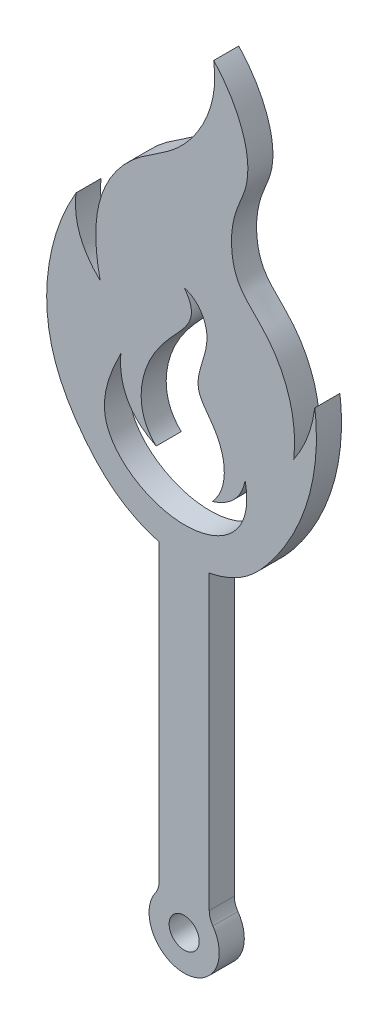
ISO-10303-21;
HEADER;
FILE_DESCRIPTION(('STEP AP214'),'2;1');
FILE_NAME('part.step','',(''),(''),'','','');
FILE_SCHEMA(('AUTOMOTIVE_DESIGN { 1 0 10303 214 1 1 1 1 }'));
ENDSEC;
DATA;
#1=APPLICATION_CONTEXT('core data for automotive mechanical design processes');
#2=APPLICATION_PROTOCOL_DEFINITION('international standard','automotive_design',2000,#1);
#3=PRODUCT_CONTEXT('',#1,'mechanical');
#4=PRODUCT('Part','Part','',(#3));
#5=PRODUCT_RELATED_PRODUCT_CATEGORY('part','',(#4));
#6=PRODUCT_DEFINITION_FORMATION('','',#4);
#7=PRODUCT_DEFINITION_CONTEXT('part definition',#1,'design');
#8=PRODUCT_DEFINITION('design','',#6,#7);
#9=PRODUCT_DEFINITION_SHAPE('','',#8);
#10=(LENGTH_UNIT() NAMED_UNIT(*) SI_UNIT(.MILLI.,.METRE.));
#11=(NAMED_UNIT(*) PLANE_ANGLE_UNIT() SI_UNIT($,.RADIAN.));
#12=(NAMED_UNIT(*) SI_UNIT($,.STERADIAN.) SOLID_ANGLE_UNIT());
#13=UNCERTAINTY_MEASURE_WITH_UNIT(LENGTH_MEASURE(1.E-05),#10,'distance_accuracy_value','');
#14=(GEOMETRIC_REPRESENTATION_CONTEXT(3) GLOBAL_UNCERTAINTY_ASSIGNED_CONTEXT((#13)) GLOBAL_UNIT_ASSIGNED_CONTEXT((#10,
#11,#12)) REPRESENTATION_CONTEXT('',''));
#15=CARTESIAN_POINT('',(0.,0.,0.));
#16=DIRECTION('',(0.,0.,1.));
#17=DIRECTION('',(1.,0.,0.));
#18=AXIS2_PLACEMENT_3D('',#15,#16,#17);
#19=CARTESIAN_POINT('',(2.5,3.16227766016838,2.5));
#20=DIRECTION('',(-1.,0.,0.));
#21=DIRECTION('',(0.,-1.,0.));
#22=AXIS2_PLACEMENT_3D('',#19,#20,#21);
#23=PLANE('',#22);
#24=DIRECTION('',(0.,0.,-1.));
#25=VECTOR('',#24,1.);
#26=CARTESIAN_POINT('',(2.5,32.3100378320783,1.25000000000002));
#27=LINE('',#26,#25);
#28=CARTESIAN_POINT('',(2.5000000000015,32.3100378320786,2.50000000000002));
#29=VERTEX_POINT('',#28);
#30=CARTESIAN_POINT('',(2.5,32.3100378320783,0.));
#31=VERTEX_POINT('',#30);
#32=EDGE_CURVE('E219',#29,#31,#27,.T.);
#33=ORIENTED_EDGE('',*,*,#32,.F.);
#34=DIRECTION('',(0.,1.,0.));
#35=VECTOR('',#34,1.);
#36=CARTESIAN_POINT('',(2.5,3.16227766016838,2.5));
#37=LINE('',#36,#35);
#38=CARTESIAN_POINT('',(2.5,3.16227766016838,2.5));
#39=VERTEX_POINT('',#38);
#40=EDGE_CURVE('E390',#39,#29,#37,.T.);
#41=ORIENTED_EDGE('',*,*,#40,.F.);
#42=DIRECTION('',(0.,0.,-1.));
#43=VECTOR('',#42,1.);
#44=CARTESIAN_POINT('',(2.5,3.16227766016838,2.5));
#45=LINE('',#44,#43);
#46=CARTESIAN_POINT('',(2.5,3.16227766016838,0.));
#47=VERTEX_POINT('',#46);
#48=EDGE_CURVE('E372',#39,#47,#45,.T.);
#49=ORIENTED_EDGE('',*,*,#48,.T.);
#50=DIRECTION('',(0.,1.,0.));
#51=VECTOR('',#50,1.);
#52=CARTESIAN_POINT('',(2.5,3.16227766016838,0.));
#53=LINE('',#52,#51);
#54=EDGE_CURVE('E378',#47,#31,#53,.T.);
#55=ORIENTED_EDGE('',*,*,#54,.T.);
#56=EDGE_LOOP('',(#33,#41,#49,#55));
#57=FACE_BOUND('',#56,.T.);
#58=ADVANCED_FACE('F34',(#57),#23,.F.);
#59=CARTESIAN_POINT('',(-2.5,3.16227766016838,2.5));
#60=DIRECTION('',(1.,0.,0.));
#61=DIRECTION('',(0.,1.,0.));
#62=AXIS2_PLACEMENT_3D('',#59,#60,#61);
#63=PLANE('',#62);
#64=DIRECTION('',(0.,0.,-1.));
#65=VECTOR('',#64,1.);
#66=CARTESIAN_POINT('',(-2.5,32.506605629833,1.25000000000002));
#67=LINE('',#66,#65);
#68=CARTESIAN_POINT('',(-2.5,32.506605629833,0.));
#69=VERTEX_POINT('',#68);
#70=CARTESIAN_POINT('',(-2.5,32.5066056324055,2.5));
#71=VERTEX_POINT('',#70);
#72=EDGE_CURVE('E11',#69,#71,#67,.F.);
#73=ORIENTED_EDGE('',*,*,#72,.F.);
#74=DIRECTION('',(0.,-1.,0.));
#75=VECTOR('',#74,1.);
#76=CARTESIAN_POINT('',(-2.5,3.16227766016838,0.));
#77=LINE('',#76,#75);
#78=CARTESIAN_POINT('',(-2.5,3.16227766016838,0.));
#79=VERTEX_POINT('',#78);
#80=EDGE_CURVE('E76',#69,#79,#77,.T.);
#81=ORIENTED_EDGE('',*,*,#80,.T.);
#82=DIRECTION('',(0.,0.,-1.));
#83=VECTOR('',#82,1.);
#84=CARTESIAN_POINT('',(-2.5,3.16227766016838,2.5));
#85=LINE('',#84,#83);
#86=CARTESIAN_POINT('',(-2.5,3.16227766016838,2.5));
#87=VERTEX_POINT('',#86);
#88=EDGE_CURVE('E385',#87,#79,#85,.T.);
#89=ORIENTED_EDGE('',*,*,#88,.F.);
#90=DIRECTION('',(0.,-1.,0.));
#91=VECTOR('',#90,1.);
#92=CARTESIAN_POINT('',(-2.5,3.16227766016838,2.5));
#93=LINE('',#92,#91);
#94=EDGE_CURVE('E54',#71,#87,#93,.T.);
#95=ORIENTED_EDGE('',*,*,#94,.F.);
#96=EDGE_LOOP('',(#73,#81,#89,#95));
#97=FACE_BOUND('',#96,.T.);
#98=ADVANCED_FACE('F341',(#97),#63,.F.);
#99=CARTESIAN_POINT('',(-4.5,3.16227766016838,2.5));
#100=DIRECTION('',(0.,0.,-1.));
#101=DIRECTION('',(-1.,0.,0.));
#102=AXIS2_PLACEMENT_3D('',#99,#100,#101);
#103=PLANE('',#102);
#104=CARTESIAN_POINT('',(-10.7828844308496,58.5055556061294,2.50000000000002));
#105=CARTESIAN_POINT('',(-13.3337516050153,54.2026792296574,2.50000000000002));
#106=CARTESIAN_POINT('',(-15.0751540388506,45.9901588664998,2.50000000000002));
#107=CARTESIAN_POINT('',(-10.4371455971129,37.9517644100799,2.50000000000002));
#108=CARTESIAN_POINT('',(-5.93812322278427,33.3860012345507,2.50000000000002));
#109=CARTESIAN_POINT('',(0.063109060391431,31.4765108150057,2.50000000000002));
#110=CARTESIAN_POINT('',(5.69453900867884,33.0265603774776,2.50000000000002));
#111=CARTESIAN_POINT('',(11.6033110764184,39.4117435546257,2.50000000000002));
#112=CARTESIAN_POINT('',(13.7437977804717,46.2030328204741,2.50000000000002));
#113=CARTESIAN_POINT('',(13.030008626531,51.8443322213992,2.50000000000002));
#114=B_SPLINE_CURVE_WITH_KNOTS('',3,(#104,#105,#106,#107,#108,#109,#110,#111,#112,#113),
.UNSPECIFIED.,.F.,.F.,(4,1,1,1,1,1,1,4),(0.,0.25660030778047,0.369111485351231,
0.450940422511403,0.57351121338714,0.663190628737763,0.725811664076517,1.),.UNSPECIFIED.);
#115=CARTESIAN_POINT('',(-10.7828844308496,58.5055556061294,2.50000000000003));
#116=VERTEX_POINT('',#115);
#117=EDGE_CURVE('E49',#71,#116,#114,.F.);
#118=ORIENTED_EDGE('',*,*,#117,.F.);
#119=ORIENTED_EDGE('',*,*,#94,.T.);
#120=CARTESIAN_POINT('',(-4.5,3.16227766016838,2.5));
#121=DIRECTION('',(0.,0.,-1.));
#122=DIRECTION('',(-1.,0.,0.));
#123=AXIS2_PLACEMENT_3D('',#120,#121,#122);
#124=CIRCLE('',#123,2.);
#125=CARTESIAN_POINT('',(-2.86363636363636,2.01235851101624,2.5));
#126=VERTEX_POINT('',#125);
#127=EDGE_CURVE('E384',#87,#126,#124,.T.);
#128=ORIENTED_EDGE('',*,*,#127,.T.);
#129=CARTESIAN_POINT('',(0.,0.,2.5));
#130=DIRECTION('',(0.,0.,1.));
#131=DIRECTION('',(1.,0.,0.));
#132=AXIS2_PLACEMENT_3D('',#129,#130,#131);
#133=CIRCLE('',#132,3.5);
#134=CARTESIAN_POINT('',(2.86363636363636,2.01235851101624,2.5));
#135=VERTEX_POINT('',#134);
#136=EDGE_CURVE('E84',#126,#135,#133,.T.);
#137=ORIENTED_EDGE('',*,*,#136,.T.);
#138=CARTESIAN_POINT('',(4.5,3.16227766016838,2.5));
#139=DIRECTION('',(0.,0.,-1.));
#140=DIRECTION('',(1.,0.,0.));
#141=AXIS2_PLACEMENT_3D('',#138,#139,#140);
#142=CIRCLE('',#141,2.);
#143=EDGE_CURVE('E371',#135,#39,#142,.T.);
#144=ORIENTED_EDGE('',*,*,#143,.T.);
#145=ORIENTED_EDGE('',*,*,#40,.T.);
#146=CARTESIAN_POINT('',(13.030008626531,51.8443322213992,2.50000000000002));
#147=VERTEX_POINT('',#146);
#148=EDGE_CURVE('E195',#147,#29,#114,.F.);
#149=ORIENTED_EDGE('',*,*,#148,.F.);
#150=CARTESIAN_POINT('',(13.030008626531,51.8443322213992,2.50000000000002));
#151=CARTESIAN_POINT('',(12.6426006479831,48.8420462863192,2.50000000000002));
#152=CARTESIAN_POINT('',(10.9272372783639,46.3427992684765,2.50000000000002));
#153=B_SPLINE_CURVE_WITH_KNOTS('',2,(#150,#151,#152),.UNSPECIFIED.,.F.,.F.,(3,3),(0.,1.),.UNSPECIFIED.);
#154=CARTESIAN_POINT('',(10.9272372783639,46.3427992684765,2.50000000000002));
#155=VERTEX_POINT('',#154);
#156=EDGE_CURVE('E161',#155,#147,#153,.F.);
#157=ORIENTED_EDGE('',*,*,#156,.F.);
#158=CARTESIAN_POINT('',(10.9272372783639,46.3427992684765,2.50000000000002));
#159=CARTESIAN_POINT('',(11.3418605065263,49.7849765863881,2.50000000000002));
#160=CARTESIAN_POINT('',(9.90208044596069,54.7177617806802,2.50000000000002));
#161=CARTESIAN_POINT('',(5.42271144464577,58.2018287041707,2.50000000000002));
#162=CARTESIAN_POINT('',(4.51207965636787,61.6286170075712,2.50000000000002));
#163=CARTESIAN_POINT('',(4.880128248429,64.613471091601,2.50000000000002));
#164=CARTESIAN_POINT('',(7.468684603869,69.6647050344175,2.50000000000002));
#165=CARTESIAN_POINT('',(5.1646224833172,74.5002552081302,2.50000000000002));
#166=CARTESIAN_POINT('',(2.94136885760252,76.8013676215523,2.50000000000002));
#167=B_SPLINE_CURVE_WITH_KNOTS('',3,(#158,#159,#160,#161,#162,#163,#164,#165,#166),
.UNSPECIFIED.,.F.,.F.,(4,1,1,1,1,1,4),(0.,0.310200107470388,0.427958128351433,0.492496183325332,
0.621965958871758,0.6910692421762,1.),.UNSPECIFIED.);
#168=CARTESIAN_POINT('',(2.94136885760252,76.8013676215523,2.50000000000002));
#169=VERTEX_POINT('',#168);
#170=EDGE_CURVE('E153',#169,#155,#167,.F.);
#171=ORIENTED_EDGE('',*,*,#170,.F.);
#172=CARTESIAN_POINT('',(2.94136885760252,76.8013676215523,2.50000000000002));
#173=CARTESIAN_POINT('',(3.31068253759557,74.5379058821106,2.50000000000002));
#174=CARTESIAN_POINT('',(2.38783075111157,70.8598437157925,2.50000000000002));
#175=CARTESIAN_POINT('',(-0.993155907628029,66.7787714512316,2.50000000000002));
#176=CARTESIAN_POINT('',(-5.37514090834626,64.5311180527801,2.50000000000002));
#177=CARTESIAN_POINT('',(-9.14623330952433,59.356108625059,2.50000000000002));
#178=CARTESIAN_POINT('',(-8.92656119235809,54.5671706019131,2.50000000000002));
#179=CARTESIAN_POINT('',(-8.36642331224053,52.1162685806547,2.50000000000002));
#180=B_SPLINE_CURVE_WITH_KNOTS('',3,(#172,#173,#174,#175,#176,#177,#178,#179),.UNSPECIFIED.,.F.,
.F.,(4,1,1,1,1,4),(0.,0.231349407316333,0.377047421683162,0.534030383380235,0.7357500279146,1.),.UNSPECIFIED.);
#181=CARTESIAN_POINT('',(-8.36642331224053,52.1162685806547,2.50000000000002));
#182=VERTEX_POINT('',#181);
#183=EDGE_CURVE('E158',#182,#169,#180,.F.);
#184=ORIENTED_EDGE('',*,*,#183,.F.);
#185=CARTESIAN_POINT('',(-8.36642331224053,52.1162685806547,2.50000000000002));
#186=CARTESIAN_POINT('',(-11.2162417345422,54.8133036008091,2.50000000000002));
#187=CARTESIAN_POINT('',(-10.7828844308496,58.5055556061294,2.50000000000002));
#188=B_SPLINE_CURVE_WITH_KNOTS('',2,(#185,#186,#187),.UNSPECIFIED.,.F.,.F.,(3,3),(0.,1.),.UNSPECIFIED.);
#189=EDGE_CURVE('E188',#116,#182,#188,.F.);
#190=ORIENTED_EDGE('',*,*,#189,.F.);
#191=EDGE_LOOP('',(#118,#119,#128,#137,#144,#145,#149,#157,#171,#184,#190));
#192=FACE_BOUND('',#191,.T.);
#193=CARTESIAN_POINT('',(2.81686200512419,38.6502821240048,2.50000000000002));
#194=CARTESIAN_POINT('',(4.4573504429854,40.4665628225132,2.50000000000002));
#195=CARTESIAN_POINT('',(4.1959277246195,44.1391346836579,2.50000000000002));
#196=CARTESIAN_POINT('',(0.370759673328368,48.0084847843146,2.50000000000002));
#197=CARTESIAN_POINT('',(3.28583190106707,52.2651398083029,2.50000000000002));
#198=CARTESIAN_POINT('',(1.41400393724742,55.3202103254666,2.50000000000002));
#199=CARTESIAN_POINT('',(0.000188370815425502,55.7018990704946,2.50000000000002));
#200=B_SPLINE_CURVE_WITH_KNOTS('',3,(#193,#194,#195,#196,#197,#198,#199),.UNSPECIFIED.,.F.,.F.,
(4,1,1,1,4),(0.,0.356718218507208,0.515081121126565,0.783237716366046,1.),.UNSPECIFIED.);
#201=CARTESIAN_POINT('',(0.000188370815425165,55.7018990704946,2.50000000000002));
#202=VERTEX_POINT('',#201);
#203=CARTESIAN_POINT('',(2.81686200512419,38.6502821240048,2.50000000000003));
#204=VERTEX_POINT('',#203);
#205=EDGE_CURVE('E203',#202,#204,#200,.F.);
#206=ORIENTED_EDGE('',*,*,#205,.T.);
#207=CARTESIAN_POINT('',(6.08186308860878,42.0807597485223,2.50000000000002));
#208=CARTESIAN_POINT('',(5.56528588609822,39.5163719228438,2.50000000000002));
#209=CARTESIAN_POINT('',(2.81686200512419,38.6502821240048,2.50000000000002));
#210=B_SPLINE_CURVE_WITH_KNOTS('',2,(#207,#208,#209),.UNSPECIFIED.,.F.,.F.,(3,3),(0.,1.),.UNSPECIFIED.);
#211=CARTESIAN_POINT('',(6.08186308860878,42.0807597485223,2.50000000000002));
#212=VERTEX_POINT('',#211);
#213=EDGE_CURVE('E210',#204,#212,#210,.F.);
#214=ORIENTED_EDGE('',*,*,#213,.T.);
#215=CARTESIAN_POINT('',(-6.31460761605691,46.8745250855768,2.50000000000002));
#216=CARTESIAN_POINT('',(-7.18547160465864,45.1329989822814,2.50000000000002));
#217=CARTESIAN_POINT('',(-9.57836322559334,39.771279985287,2.50000000000002));
#218=CARTESIAN_POINT('',(-0.639228761435003,32.9896866886364,2.50000000000002));
#219=CARTESIAN_POINT('',(7.18407334828019,36.7794564296278,2.50000000000002));
#220=CARTESIAN_POINT('',(6.08186308860878,42.0807597485223,2.50000000000002));
#221=B_SPLINE_CURVE_WITH_KNOTS('',3,(#215,#216,#217,#218,#219,#220),.UNSPECIFIED.,.F.,.F.,(4,1,
1,4),(0.,0.245235376848768,0.54368064614375,1.),.UNSPECIFIED.);
#222=CARTESIAN_POINT('',(-6.31460761605691,46.8745250855768,2.50000000000002));
#223=VERTEX_POINT('',#222);
#224=EDGE_CURVE('E227',#212,#223,#221,.F.);
#225=ORIENTED_EDGE('',*,*,#224,.T.);
#226=CARTESIAN_POINT('',(-2.78713535928849,40.6367637385724,2.50000000000002));
#227=CARTESIAN_POINT('',(-6.67157744668054,42.5044283026781,2.50000000000002));
#228=CARTESIAN_POINT('',(-6.31460761605691,46.8745250855768,2.50000000000002));
#229=B_SPLINE_CURVE_WITH_KNOTS('',2,(#226,#227,#228),.UNSPECIFIED.,.F.,.F.,(3,3),(0.,1.),.UNSPECIFIED.);
#230=CARTESIAN_POINT('',(-2.78713535928849,40.6367637385724,2.50000000000002));
#231=VERTEX_POINT('',#230);
#232=EDGE_CURVE('E220',#223,#231,#229,.F.);
#233=ORIENTED_EDGE('',*,*,#232,.T.);
#234=CARTESIAN_POINT('',(0.000188370815425165,55.7018990704946,2.50000000000002));
#235=CARTESIAN_POINT('',(1.63793006317038,53.699479572548,2.50000000000002));
#236=CARTESIAN_POINT('',(-1.08050730827456,51.2541148380023,2.50000000000002));
#237=CARTESIAN_POINT('',(-4.43793518646484,46.8553637518247,2.50000000000002));
#238=CARTESIAN_POINT('',(-4.71908580438077,42.4288952590665,2.50000000000002));
#239=CARTESIAN_POINT('',(-2.78713535928849,40.6367637385724,2.50000000000002));
#240=B_SPLINE_CURVE_WITH_KNOTS('',3,(#234,#235,#236,#237,#238,#239),.UNSPECIFIED.,.F.,.F.,(4,1,
1,4),(0.,0.313581212956224,0.580495324080973,1.),.UNSPECIFIED.);
#241=EDGE_CURVE('E212',#231,#202,#240,.F.);
#242=ORIENTED_EDGE('',*,*,#241,.T.);
#243=EDGE_LOOP('',(#206,#214,#225,#233,#242));
#244=FACE_BOUND('',#243,.T.);
#245=CARTESIAN_POINT('',(0.,0.,2.5));
#246=DIRECTION('',(0.,0.,1.));
#247=DIRECTION('',(1.,0.,0.));
#248=AXIS2_PLACEMENT_3D('',#245,#246,#247);
#249=CIRCLE('',#248,1.5);
#250=CARTESIAN_POINT('',(1.5,0.,2.5));
#251=VERTEX_POINT('',#250);
#252=EDGE_CURVE('E395',#251,#251,#249,.T.);
#253=ORIENTED_EDGE('',*,*,#252,.F.);
#254=EDGE_LOOP('',(#253));
#255=FACE_BOUND('',#254,.T.);
#256=ADVANCED_FACE('F155',(#192,#244,#255),#103,.F.);
#257=CARTESIAN_POINT('',(-4.5,3.16227766016838,0.));
#258=DIRECTION('',(0.,0.,-1.));
#259=DIRECTION('',(-1.,0.,0.));
#260=AXIS2_PLACEMENT_3D('',#257,#258,#259);
#261=PLANE('',#260);
#262=CARTESIAN_POINT('',(-10.7828844308496,58.5055556061294,0.));
#263=CARTESIAN_POINT('',(-13.3337516050153,54.2026792296574,0.));
#264=CARTESIAN_POINT('',(-15.0751540388506,45.9901588664998,0.));
#265=CARTESIAN_POINT('',(-10.4371455971129,37.9517644100799,0.));
#266=CARTESIAN_POINT('',(-5.93812322278427,33.3860012345507,0.));
#267=CARTESIAN_POINT('',(0.063109060391431,31.4765108150057,0.));
#268=CARTESIAN_POINT('',(5.69453900867884,33.0265603774776,0.));
#269=CARTESIAN_POINT('',(11.6033110764184,39.4117435546257,0.));
#270=CARTESIAN_POINT('',(13.7437977804717,46.2030328204741,0.));
#271=CARTESIAN_POINT('',(13.030008626531,51.8443322213992,0.));
#272=B_SPLINE_CURVE_WITH_KNOTS('',3,(#262,#263,#264,#265,#266,#267,#268,#269,#270,#271),
.UNSPECIFIED.,.F.,.F.,(4,1,1,1,1,1,1,4),(0.,0.25660030778047,0.369111485351231,
0.450940422511403,0.57351121338714,0.663190628737763,0.725811664076517,1.),.UNSPECIFIED.);
#273=CARTESIAN_POINT('',(13.030008626531,51.8443322213992,0.));
#274=VERTEX_POINT('',#273);
#275=EDGE_CURVE('E411',#31,#274,#272,.T.);
#276=ORIENTED_EDGE('',*,*,#275,.F.);
#277=ORIENTED_EDGE('',*,*,#54,.F.);
#278=CARTESIAN_POINT('',(4.5,3.16227766016838,0.));
#279=DIRECTION('',(0.,0.,-1.));
#280=DIRECTION('',(1.,0.,0.));
#281=AXIS2_PLACEMENT_3D('',#278,#279,#280);
#282=CIRCLE('',#281,2.);
#283=CARTESIAN_POINT('',(2.86363636363636,2.01235851101624,0.));
#284=VERTEX_POINT('',#283);
#285=EDGE_CURVE('E366',#284,#47,#282,.T.);
#286=ORIENTED_EDGE('',*,*,#285,.F.);
#287=CARTESIAN_POINT('',(0.,0.,0.));
#288=DIRECTION('',(0.,0.,1.));
#289=DIRECTION('',(1.,0.,0.));
#290=AXIS2_PLACEMENT_3D('',#287,#288,#289);
#291=CIRCLE('',#290,3.5);
#292=CARTESIAN_POINT('',(-2.86363636363636,2.01235851101624,0.));
#293=VERTEX_POINT('',#292);
#294=EDGE_CURVE('E358',#293,#284,#291,.T.);
#295=ORIENTED_EDGE('',*,*,#294,.F.);
#296=CARTESIAN_POINT('',(-4.5,3.16227766016838,0.));
#297=DIRECTION('',(0.,0.,-1.));
#298=DIRECTION('',(-1.,0.,0.));
#299=AXIS2_PLACEMENT_3D('',#296,#297,#298);
#300=CIRCLE('',#299,2.);
#301=EDGE_CURVE('E367',#79,#293,#300,.T.);
#302=ORIENTED_EDGE('',*,*,#301,.F.);
#303=ORIENTED_EDGE('',*,*,#80,.F.);
#304=CARTESIAN_POINT('',(-10.7828844308496,58.5055556061294,0.));
#305=VERTEX_POINT('',#304);
#306=EDGE_CURVE('E406',#305,#69,#272,.T.);
#307=ORIENTED_EDGE('',*,*,#306,.F.);
#308=CARTESIAN_POINT('',(-8.36642331224053,52.1162685806547,0.));
#309=CARTESIAN_POINT('',(-11.2162417345422,54.8133036008091,0.));
#310=CARTESIAN_POINT('',(-10.7828844308496,58.5055556061294,0.));
#311=B_SPLINE_CURVE_WITH_KNOTS('',2,(#308,#309,#310),.UNSPECIFIED.,.F.,.F.,(3,3),(0.,1.),.UNSPECIFIED.);
#312=CARTESIAN_POINT('',(-8.36642331224053,52.1162685806547,0.));
#313=VERTEX_POINT('',#312);
#314=EDGE_CURVE('E408',#313,#305,#311,.T.);
#315=ORIENTED_EDGE('',*,*,#314,.F.);
#316=CARTESIAN_POINT('',(2.94136885760252,76.8013676215523,0.));
#317=CARTESIAN_POINT('',(3.31068253759557,74.5379058821106,0.));
#318=CARTESIAN_POINT('',(2.38783075111157,70.8598437157925,0.));
#319=CARTESIAN_POINT('',(-0.993155907628029,66.7787714512316,0.));
#320=CARTESIAN_POINT('',(-5.37514090834626,64.5311180527801,0.));
#321=CARTESIAN_POINT('',(-9.14623330952433,59.356108625059,0.));
#322=CARTESIAN_POINT('',(-8.92656119235809,54.5671706019131,0.));
#323=CARTESIAN_POINT('',(-8.36642331224053,52.1162685806547,0.));
#324=B_SPLINE_CURVE_WITH_KNOTS('',3,(#316,#317,#318,#319,#320,#321,#322,#323),.UNSPECIFIED.,.F.,
.F.,(4,1,1,1,1,4),(0.,0.231349407316333,0.377047421683162,0.534030383380235,0.7357500279146,1.),.UNSPECIFIED.);
#325=CARTESIAN_POINT('',(2.94136885760252,76.8013676215523,0.));
#326=VERTEX_POINT('',#325);
#327=EDGE_CURVE('E175',#326,#313,#324,.T.);
#328=ORIENTED_EDGE('',*,*,#327,.F.);
#329=CARTESIAN_POINT('',(10.9272372783639,46.3427992684765,0.));
#330=CARTESIAN_POINT('',(11.3418605065263,49.7849765863881,0.));
#331=CARTESIAN_POINT('',(9.90208044596069,54.7177617806802,0.));
#332=CARTESIAN_POINT('',(5.42271144464577,58.2018287041707,0.));
#333=CARTESIAN_POINT('',(4.51207965636787,61.6286170075712,0.));
#334=CARTESIAN_POINT('',(4.880128248429,64.613471091601,0.));
#335=CARTESIAN_POINT('',(7.468684603869,69.6647050344175,0.));
#336=CARTESIAN_POINT('',(5.1646224833172,74.5002552081302,0.));
#337=CARTESIAN_POINT('',(2.94136885760252,76.8013676215523,0.));
#338=B_SPLINE_CURVE_WITH_KNOTS('',3,(#329,#330,#331,#332,#333,#334,#335,#336,#337),
.UNSPECIFIED.,.F.,.F.,(4,1,1,1,1,1,4),(0.,0.310200107470388,0.427958128351433,0.492496183325332,
0.621965958871758,0.6910692421762,1.),.UNSPECIFIED.);
#339=CARTESIAN_POINT('',(10.9272372783639,46.3427992684765,0.));
#340=VERTEX_POINT('',#339);
#341=EDGE_CURVE('E171',#340,#326,#338,.T.);
#342=ORIENTED_EDGE('',*,*,#341,.F.);
#343=CARTESIAN_POINT('',(13.030008626531,51.8443322213992,0.));
#344=CARTESIAN_POINT('',(12.6426006479831,48.8420462863192,0.));
#345=CARTESIAN_POINT('',(10.9272372783639,46.3427992684765,0.));
#346=B_SPLINE_CURVE_WITH_KNOTS('',2,(#343,#344,#345),.UNSPECIFIED.,.F.,.F.,(3,3),(0.,1.),.UNSPECIFIED.);
#347=EDGE_CURVE('E165',#274,#340,#346,.T.);
#348=ORIENTED_EDGE('',*,*,#347,.F.);
#349=EDGE_LOOP('',(#276,#277,#286,#295,#302,#303,#307,#315,#328,#342,#348));
#350=FACE_BOUND('',#349,.T.);
#351=CARTESIAN_POINT('',(6.08186308860878,42.0807597485223,0.));
#352=CARTESIAN_POINT('',(5.56528588609822,39.5163719228438,0.));
#353=CARTESIAN_POINT('',(2.81686200512419,38.6502821240048,0.));
#354=B_SPLINE_CURVE_WITH_KNOTS('',2,(#351,#352,#353),.UNSPECIFIED.,.F.,.F.,(3,3),(0.,1.),.UNSPECIFIED.);
#355=CARTESIAN_POINT('',(6.08186308860878,42.0807597485223,0.));
#356=VERTEX_POINT('',#355);
#357=CARTESIAN_POINT('',(2.81686200512419,38.6502821240048,0.));
#358=VERTEX_POINT('',#357);
#359=EDGE_CURVE('E443',#356,#358,#354,.T.);
#360=ORIENTED_EDGE('',*,*,#359,.T.);
#361=CARTESIAN_POINT('',(2.81686200512419,38.6502821240048,0.));
#362=CARTESIAN_POINT('',(4.4573504429854,40.4665628225132,0.));
#363=CARTESIAN_POINT('',(4.1959277246195,44.1391346836579,0.));
#364=CARTESIAN_POINT('',(0.370759673328368,48.0084847843146,0.));
#365=CARTESIAN_POINT('',(3.28583190106707,52.2651398083029,0.));
#366=CARTESIAN_POINT('',(1.41400393724742,55.3202103254666,0.));
#367=CARTESIAN_POINT('',(0.000188370815425502,55.7018990704946,0.));
#368=B_SPLINE_CURVE_WITH_KNOTS('',3,(#361,#362,#363,#364,#365,#366,#367),.UNSPECIFIED.,.F.,.F.,
(4,1,1,1,4),(0.,0.356718218507208,0.515081121126565,0.783237716366046,1.),.UNSPECIFIED.);
#369=CARTESIAN_POINT('',(0.000188370815425165,55.7018990704946,0.));
#370=VERTEX_POINT('',#369);
#371=EDGE_CURVE('E451',#358,#370,#368,.T.);
#372=ORIENTED_EDGE('',*,*,#371,.T.);
#373=CARTESIAN_POINT('',(0.000188370815425165,55.7018990704946,0.));
#374=CARTESIAN_POINT('',(1.63793006317038,53.699479572548,0.));
#375=CARTESIAN_POINT('',(-1.08050730827456,51.2541148380023,0.));
#376=CARTESIAN_POINT('',(-4.43793518646484,46.8553637518247,0.));
#377=CARTESIAN_POINT('',(-4.71908580438077,42.4288952590665,0.));
#378=CARTESIAN_POINT('',(-2.78713535928849,40.6367637385724,0.));
#379=B_SPLINE_CURVE_WITH_KNOTS('',3,(#373,#374,#375,#376,#377,#378),.UNSPECIFIED.,.F.,.F.,(4,1,
1,4),(0.,0.313581212956224,0.580495324080973,1.),.UNSPECIFIED.);
#380=CARTESIAN_POINT('',(-2.78713535928849,40.6367637385724,0.));
#381=VERTEX_POINT('',#380);
#382=EDGE_CURVE('E468',#370,#381,#379,.T.);
#383=ORIENTED_EDGE('',*,*,#382,.T.);
#384=CARTESIAN_POINT('',(-2.78713535928849,40.6367637385724,0.));
#385=CARTESIAN_POINT('',(-6.67157744668054,42.5044283026781,0.));
#386=CARTESIAN_POINT('',(-6.31460761605691,46.8745250855768,0.));
#387=B_SPLINE_CURVE_WITH_KNOTS('',2,(#384,#385,#386),.UNSPECIFIED.,.F.,.F.,(3,3),(0.,1.),.UNSPECIFIED.);
#388=CARTESIAN_POINT('',(-6.31460761605691,46.8745250855768,0.));
#389=VERTEX_POINT('',#388);
#390=EDGE_CURVE('E460',#381,#389,#387,.T.);
#391=ORIENTED_EDGE('',*,*,#390,.T.);
#392=CARTESIAN_POINT('',(-6.31460761605691,46.8745250855768,0.));
#393=CARTESIAN_POINT('',(-7.18547160465864,45.1329989822814,0.));
#394=CARTESIAN_POINT('',(-9.57836322559334,39.771279985287,0.));
#395=CARTESIAN_POINT('',(-0.639228761435003,32.9896866886364,0.));
#396=CARTESIAN_POINT('',(7.18407334828019,36.7794564296278,0.));
#397=CARTESIAN_POINT('',(6.08186308860878,42.0807597485223,0.));
#398=B_SPLINE_CURVE_WITH_KNOTS('',3,(#392,#393,#394,#395,#396,#397),.UNSPECIFIED.,.F.,.F.,(4,1,
1,4),(0.,0.245235376848768,0.54368064614375,1.),.UNSPECIFIED.);
#399=EDGE_CURVE('E452',#389,#356,#398,.T.);
#400=ORIENTED_EDGE('',*,*,#399,.T.);
#401=EDGE_LOOP('',(#360,#372,#383,#391,#400));
#402=FACE_BOUND('',#401,.T.);
#403=CARTESIAN_POINT('',(0.,0.,0.));
#404=DIRECTION('',(0.,0.,1.));
#405=DIRECTION('',(1.,0.,0.));
#406=AXIS2_PLACEMENT_3D('',#403,#404,#405);
#407=CIRCLE('',#406,1.5);
#408=CARTESIAN_POINT('',(1.5,0.,0.));
#409=VERTEX_POINT('',#408);
#410=EDGE_CURVE('E397',#409,#409,#407,.T.);
#411=ORIENTED_EDGE('',*,*,#410,.T.);
#412=EDGE_LOOP('',(#411));
#413=FACE_BOUND('',#412,.T.);
#414=ADVANCED_FACE('F340',(#350,#402,#413),#261,.T.);
#415=CARTESIAN_POINT('',(-4.5,3.16227766016838,2.5));
#416=DIRECTION('',(0.,0.,-1.));
#417=DIRECTION('',(-1.,0.,0.));
#418=AXIS2_PLACEMENT_3D('',#415,#416,#417);
#419=CYLINDRICAL_SURFACE('',#418,2.);
#420=ORIENTED_EDGE('',*,*,#301,.T.);
#421=DIRECTION('',(0.,0.,-1.));
#422=VECTOR('',#421,1.);
#423=CARTESIAN_POINT('',(-2.86363636363636,2.01235851101624,2.5));
#424=LINE('',#423,#422);
#425=EDGE_CURVE('E42',#126,#293,#424,.T.);
#426=ORIENTED_EDGE('',*,*,#425,.F.);
#427=ORIENTED_EDGE('',*,*,#127,.F.);
#428=ORIENTED_EDGE('',*,*,#88,.T.);
#429=EDGE_LOOP('',(#420,#426,#427,#428));
#430=FACE_BOUND('',#429,.T.);
#431=ADVANCED_FACE('F36',(#430),#419,.F.);
#432=CARTESIAN_POINT('',(0.,0.,2.5));
#433=DIRECTION('',(0.,0.,-1.));
#434=DIRECTION('',(-1.,0.,0.));
#435=AXIS2_PLACEMENT_3D('',#432,#433,#434);
#436=CYLINDRICAL_SURFACE('',#435,3.5);
#437=ORIENTED_EDGE('',*,*,#294,.T.);
#438=DIRECTION('',(0.,0.,-1.));
#439=VECTOR('',#438,1.);
#440=CARTESIAN_POINT('',(2.86363636363636,2.01235851101624,2.5));
#441=LINE('',#440,#439);
#442=EDGE_CURVE('E360',#135,#284,#441,.T.);
#443=ORIENTED_EDGE('',*,*,#442,.F.);
#444=ORIENTED_EDGE('',*,*,#136,.F.);
#445=ORIENTED_EDGE('',*,*,#425,.T.);
#446=EDGE_LOOP('',(#437,#443,#444,#445));
#447=FACE_BOUND('',#446,.T.);
#448=ADVANCED_FACE('F351',(#447),#436,.T.);
#449=CARTESIAN_POINT('',(4.5,3.16227766016838,2.5));
#450=DIRECTION('',(0.,0.,-1.));
#451=DIRECTION('',(-1.,0.,0.));
#452=AXIS2_PLACEMENT_3D('',#449,#450,#451);
#453=CYLINDRICAL_SURFACE('',#452,2.);
#454=ORIENTED_EDGE('',*,*,#285,.T.);
#455=ORIENTED_EDGE('',*,*,#48,.F.);
#456=ORIENTED_EDGE('',*,*,#143,.F.);
#457=ORIENTED_EDGE('',*,*,#442,.T.);
#458=EDGE_LOOP('',(#454,#455,#456,#457));
#459=FACE_BOUND('',#458,.T.);
#460=ADVANCED_FACE('F336',(#459),#453,.F.);
#461=CARTESIAN_POINT('',(0.,0.,2.5));
#462=DIRECTION('',(0.,0.,-1.));
#463=DIRECTION('',(-1.,0.,0.));
#464=AXIS2_PLACEMENT_3D('',#461,#462,#463);
#465=CYLINDRICAL_SURFACE('',#464,1.5);
#466=ORIENTED_EDGE('',*,*,#252,.T.);
#467=EDGE_LOOP('',(#466));
#468=FACE_BOUND('',#467,.T.);
#469=ORIENTED_EDGE('',*,*,#410,.F.);
#470=EDGE_LOOP('',(#469));
#471=FACE_BOUND('',#470,.T.);
#472=ADVANCED_FACE('F253',(#468,#471),#465,.F.);
#473=CARTESIAN_POINT('',(-10.7828844308496,58.5055556061294,56.2110289279434));
#474=CARTESIAN_POINT('',(-13.3337516050153,54.2026792296574,56.2110289279434));
#475=CARTESIAN_POINT('',(-15.0751540388506,45.9901588664998,56.2110289279434));
#476=CARTESIAN_POINT('',(-10.4371455971129,37.9517644100799,56.2110289279434));
#477=CARTESIAN_POINT('',(-5.93812322278427,33.3860012345507,56.2110289279434));
#478=CARTESIAN_POINT('',(0.063109060391431,31.4765108150057,56.2110289279434));
#479=CARTESIAN_POINT('',(5.69453900867884,33.0265603774776,56.2110289279434));
#480=CARTESIAN_POINT('',(11.6033110764184,39.4117435546257,56.2110289279434));
#481=CARTESIAN_POINT('',(13.7437977804717,46.2030328204741,56.2110289279434));
#482=CARTESIAN_POINT('',(13.030008626531,51.8443322213992,56.2110289279434));
#483=B_SPLINE_CURVE_WITH_KNOTS('',3,(#473,#474,#475,#476,#477,#478,#479,#480,#481,#482),
.UNSPECIFIED.,.F.,.F.,(4,1,1,1,1,1,1,4),(0.,0.25660030778047,0.369111485351231,
0.450940422511403,0.57351121338714,0.663190628737763,0.725811664076517,1.),.UNSPECIFIED.);
#484=DIRECTION('',(0.,0.,-1.));
#485=VECTOR('',#484,1.);
#486=SURFACE_OF_LINEAR_EXTRUSION('',#483,#485);
#487=ORIENTED_EDGE('',*,*,#148,.T.);
#488=ORIENTED_EDGE('',*,*,#32,.T.);
#489=ORIENTED_EDGE('',*,*,#275,.T.);
#490=DIRECTION('',(0.,0.,-1.));
#491=VECTOR('',#490,1.);
#492=CARTESIAN_POINT('',(13.030008626531,51.8443322213992,56.2110289279434));
#493=LINE('',#492,#491);
#494=EDGE_CURVE('E442',#147,#274,#493,.T.);
#495=ORIENTED_EDGE('',*,*,#494,.F.);
#496=EDGE_LOOP('',(#487,#488,#489,#495));
#497=FACE_BOUND('',#496,.T.);
#498=ADVANCED_FACE('F249',(#497),#486,.F.);
#499=ORIENTED_EDGE('',*,*,#306,.T.);
#500=ORIENTED_EDGE('',*,*,#72,.T.);
#501=ORIENTED_EDGE('',*,*,#117,.T.);
#502=DIRECTION('',(0.,0.,-1.));
#503=VECTOR('',#502,1.);
#504=CARTESIAN_POINT('',(-10.7828844308496,58.5055556061294,56.2110289279434));
#505=LINE('',#504,#503);
#506=EDGE_CURVE('E202',#116,#305,#505,.T.);
#507=ORIENTED_EDGE('',*,*,#506,.T.);
#508=EDGE_LOOP('',(#499,#500,#501,#507));
#509=FACE_BOUND('',#508,.T.);
#510=ADVANCED_FACE('F252',(#509),#486,.F.);
#511=CARTESIAN_POINT('',(13.030008626531,51.8443322213992,56.2110289279434));
#512=CARTESIAN_POINT('',(12.6426006479831,48.8420462863192,56.2110289279434));
#513=CARTESIAN_POINT('',(10.9272372783639,46.3427992684765,56.2110289279434));
#514=B_SPLINE_CURVE_WITH_KNOTS('',2,(#511,#512,#513),.UNSPECIFIED.,.F.,.F.,(3,3),(0.,1.),.UNSPECIFIED.);
#515=DIRECTION('',(0.,0.,-1.));
#516=VECTOR('',#515,1.);
#517=SURFACE_OF_LINEAR_EXTRUSION('',#514,#516);
#518=DIRECTION('',(0.,0.,-1.));
#519=VECTOR('',#518,1.);
#520=CARTESIAN_POINT('',(10.9272372783639,46.3427992684765,56.2110289279434));
#521=LINE('',#520,#519);
#522=EDGE_CURVE('E164',#155,#340,#521,.T.);
#523=ORIENTED_EDGE('',*,*,#522,.F.);
#524=ORIENTED_EDGE('',*,*,#156,.T.);
#525=ORIENTED_EDGE('',*,*,#494,.T.);
#526=ORIENTED_EDGE('',*,*,#347,.T.);
#527=EDGE_LOOP('',(#523,#524,#525,#526));
#528=FACE_BOUND('',#527,.T.);
#529=ADVANCED_FACE('F288',(#528),#517,.F.);
#530=CARTESIAN_POINT('',(10.9272372783639,46.3427992684765,56.2110289279434));
#531=CARTESIAN_POINT('',(11.3418605065263,49.7849765863881,56.2110289279434));
#532=CARTESIAN_POINT('',(9.90208044596069,54.7177617806802,56.2110289279434));
#533=CARTESIAN_POINT('',(5.42271144464577,58.2018287041707,56.2110289279434));
#534=CARTESIAN_POINT('',(4.51207965636787,61.6286170075712,56.2110289279434));
#535=CARTESIAN_POINT('',(4.880128248429,64.613471091601,56.2110289279434));
#536=CARTESIAN_POINT('',(7.468684603869,69.6647050344175,56.2110289279434));
#537=CARTESIAN_POINT('',(5.1646224833172,74.5002552081302,56.2110289279434));
#538=CARTESIAN_POINT('',(2.94136885760252,76.8013676215523,56.2110289279434));
#539=B_SPLINE_CURVE_WITH_KNOTS('',3,(#530,#531,#532,#533,#534,#535,#536,#537,#538),
.UNSPECIFIED.,.F.,.F.,(4,1,1,1,1,1,4),(0.,0.310200107470388,0.427958128351433,0.492496183325332,
0.621965958871758,0.6910692421762,1.),.UNSPECIFIED.);
#540=DIRECTION('',(0.,0.,-1.));
#541=VECTOR('',#540,1.);
#542=SURFACE_OF_LINEAR_EXTRUSION('',#539,#541);
#543=DIRECTION('',(0.,0.,-1.));
#544=VECTOR('',#543,1.);
#545=CARTESIAN_POINT('',(2.94136885760252,76.8013676215523,56.2110289279434));
#546=LINE('',#545,#544);
#547=EDGE_CURVE('E168',#169,#326,#546,.T.);
#548=ORIENTED_EDGE('',*,*,#547,.F.);
#549=ORIENTED_EDGE('',*,*,#170,.T.);
#550=ORIENTED_EDGE('',*,*,#522,.T.);
#551=ORIENTED_EDGE('',*,*,#341,.T.);
#552=EDGE_LOOP('',(#548,#549,#550,#551));
#553=FACE_BOUND('',#552,.T.);
#554=ADVANCED_FACE('F169',(#553),#542,.F.);
#555=CARTESIAN_POINT('',(2.94136885760252,76.8013676215523,56.2110289279434));
#556=CARTESIAN_POINT('',(3.31068253759557,74.5379058821106,56.2110289279434));
#557=CARTESIAN_POINT('',(2.38783075111157,70.8598437157925,56.2110289279434));
#558=CARTESIAN_POINT('',(-0.993155907628029,66.7787714512316,56.2110289279434));
#559=CARTESIAN_POINT('',(-5.37514090834626,64.5311180527801,56.2110289279434));
#560=CARTESIAN_POINT('',(-9.14623330952433,59.356108625059,56.2110289279434));
#561=CARTESIAN_POINT('',(-8.92656119235809,54.5671706019131,56.2110289279434));
#562=CARTESIAN_POINT('',(-8.36642331224053,52.1162685806547,56.2110289279434));
#563=B_SPLINE_CURVE_WITH_KNOTS('',3,(#555,#556,#557,#558,#559,#560,#561,#562),.UNSPECIFIED.,.F.,
.F.,(4,1,1,1,1,4),(0.,0.231349407316333,0.377047421683162,0.534030383380235,0.7357500279146,1.),.UNSPECIFIED.);
#564=DIRECTION('',(0.,0.,-1.));
#565=VECTOR('',#564,1.);
#566=SURFACE_OF_LINEAR_EXTRUSION('',#563,#565);
#567=DIRECTION('',(0.,0.,-1.));
#568=VECTOR('',#567,1.);
#569=CARTESIAN_POINT('',(-8.36642331224053,52.1162685806547,56.2110289279434));
#570=LINE('',#569,#568);
#571=EDGE_CURVE('E178',#182,#313,#570,.T.);
#572=ORIENTED_EDGE('',*,*,#571,.F.);
#573=ORIENTED_EDGE('',*,*,#183,.T.);
#574=ORIENTED_EDGE('',*,*,#547,.T.);
#575=ORIENTED_EDGE('',*,*,#327,.T.);
#576=EDGE_LOOP('',(#572,#573,#574,#575));
#577=FACE_BOUND('',#576,.T.);
#578=ADVANCED_FACE('F177',(#577),#566,.F.);
#579=CARTESIAN_POINT('',(-8.36642331224053,52.1162685806547,56.2110289279434));
#580=CARTESIAN_POINT('',(-11.2162417345422,54.8133036008091,56.2110289279434));
#581=CARTESIAN_POINT('',(-10.7828844308496,58.5055556061294,56.2110289279434));
#582=B_SPLINE_CURVE_WITH_KNOTS('',2,(#579,#580,#581),.UNSPECIFIED.,.F.,.F.,(3,3),(0.,1.),.UNSPECIFIED.);
#583=DIRECTION('',(0.,0.,-1.));
#584=VECTOR('',#583,1.);
#585=SURFACE_OF_LINEAR_EXTRUSION('',#582,#584);
#586=ORIENTED_EDGE('',*,*,#506,.F.);
#587=ORIENTED_EDGE('',*,*,#189,.T.);
#588=ORIENTED_EDGE('',*,*,#571,.T.);
#589=ORIENTED_EDGE('',*,*,#314,.T.);
#590=EDGE_LOOP('',(#586,#587,#588,#589));
#591=FACE_BOUND('',#590,.T.);
#592=ADVANCED_FACE('F255',(#591),#585,.F.);
#593=CARTESIAN_POINT('',(2.81686200512419,38.6502821240048,56.2110289279434));
#594=CARTESIAN_POINT('',(4.4573504429854,40.4665628225132,56.2110289279434));
#595=CARTESIAN_POINT('',(4.1959277246195,44.1391346836579,56.2110289279434));
#596=CARTESIAN_POINT('',(0.370759673328368,48.0084847843146,56.2110289279434));
#597=CARTESIAN_POINT('',(3.28583190106707,52.2651398083029,56.2110289279434));
#598=CARTESIAN_POINT('',(1.41400393724742,55.3202103254666,56.2110289279434));
#599=CARTESIAN_POINT('',(0.000188370815425502,55.7018990704946,56.2110289279434));
#600=B_SPLINE_CURVE_WITH_KNOTS('',3,(#593,#594,#595,#596,#597,#598,#599),.UNSPECIFIED.,.F.,.F.,
(4,1,1,1,4),(0.,0.356718218507208,0.515081121126565,0.783237716366046,1.),.UNSPECIFIED.);
#601=DIRECTION('',(0.,0.,-1.));
#602=VECTOR('',#601,1.);
#603=SURFACE_OF_LINEAR_EXTRUSION('',#600,#602);
#604=ORIENTED_EDGE('',*,*,#205,.F.);
#605=DIRECTION('',(0.,0.,-1.));
#606=VECTOR('',#605,1.);
#607=CARTESIAN_POINT('',(0.000188370815425165,55.7018990704946,56.2110289279434));
#608=LINE('',#607,#606);
#609=EDGE_CURVE('E410',#202,#370,#608,.T.);
#610=ORIENTED_EDGE('',*,*,#609,.T.);
#611=ORIENTED_EDGE('',*,*,#371,.F.);
#612=DIRECTION('',(0.,0.,-1.));
#613=VECTOR('',#612,1.);
#614=CARTESIAN_POINT('',(2.81686200512419,38.6502821240048,56.2110289279434));
#615=LINE('',#614,#613);
#616=EDGE_CURVE('E211',#204,#358,#615,.T.);
#617=ORIENTED_EDGE('',*,*,#616,.F.);
#618=EDGE_LOOP('',(#604,#610,#611,#617));
#619=FACE_BOUND('',#618,.T.);
#620=ADVANCED_FACE('F258',(#619),#603,.T.);
#621=CARTESIAN_POINT('',(0.000188370815425165,55.7018990704946,56.2110289279434));
#622=CARTESIAN_POINT('',(1.63793006317038,53.699479572548,56.2110289279434));
#623=CARTESIAN_POINT('',(-1.08050730827456,51.2541148380023,56.2110289279434));
#624=CARTESIAN_POINT('',(-4.43793518646484,46.8553637518247,56.2110289279434));
#625=CARTESIAN_POINT('',(-4.71908580438077,42.4288952590665,56.2110289279434));
#626=CARTESIAN_POINT('',(-2.78713535928849,40.6367637385724,56.2110289279434));
#627=B_SPLINE_CURVE_WITH_KNOTS('',3,(#621,#622,#623,#624,#625,#626),.UNSPECIFIED.,.F.,.F.,(4,1,
1,4),(0.,0.313581212956224,0.580495324080973,1.),.UNSPECIFIED.);
#628=DIRECTION('',(0.,0.,-1.));
#629=VECTOR('',#628,1.);
#630=SURFACE_OF_LINEAR_EXTRUSION('',#627,#629);
#631=ORIENTED_EDGE('',*,*,#241,.F.);
#632=DIRECTION('',(0.,0.,-1.));
#633=VECTOR('',#632,1.);
#634=CARTESIAN_POINT('',(-2.78713535928849,40.6367637385724,56.2110289279434));
#635=LINE('',#634,#633);
#636=EDGE_CURVE('E413',#231,#381,#635,.T.);
#637=ORIENTED_EDGE('',*,*,#636,.T.);
#638=ORIENTED_EDGE('',*,*,#382,.F.);
#639=ORIENTED_EDGE('',*,*,#609,.F.);
#640=EDGE_LOOP('',(#631,#637,#638,#639));
#641=FACE_BOUND('',#640,.T.);
#642=ADVANCED_FACE('F327',(#641),#630,.T.);
#643=CARTESIAN_POINT('',(-2.78713535928849,40.6367637385724,56.2110289279434));
#644=CARTESIAN_POINT('',(-6.67157744668054,42.5044283026781,56.2110289279434));
#645=CARTESIAN_POINT('',(-6.31460761605691,46.8745250855768,56.2110289279434));
#646=B_SPLINE_CURVE_WITH_KNOTS('',2,(#643,#644,#645),.UNSPECIFIED.,.F.,.F.,(3,3),(0.,1.),.UNSPECIFIED.);
#647=DIRECTION('',(0.,0.,-1.));
#648=VECTOR('',#647,1.);
#649=SURFACE_OF_LINEAR_EXTRUSION('',#646,#648);
#650=ORIENTED_EDGE('',*,*,#232,.F.);
#651=DIRECTION('',(0.,0.,-1.));
#652=VECTOR('',#651,1.);
#653=CARTESIAN_POINT('',(-6.31460761605691,46.8745250855768,56.2110289279434));
#654=LINE('',#653,#652);
#655=EDGE_CURVE('E498',#223,#389,#654,.T.);
#656=ORIENTED_EDGE('',*,*,#655,.T.);
#657=ORIENTED_EDGE('',*,*,#390,.F.);
#658=ORIENTED_EDGE('',*,*,#636,.F.);
#659=EDGE_LOOP('',(#650,#656,#657,#658));
#660=FACE_BOUND('',#659,.T.);
#661=ADVANCED_FACE('F299',(#660),#649,.T.);
#662=CARTESIAN_POINT('',(-6.31460761605691,46.8745250855768,56.2110289279434));
#663=CARTESIAN_POINT('',(-7.18547160465864,45.1329989822814,56.2110289279434));
#664=CARTESIAN_POINT('',(-9.57836322559334,39.771279985287,56.2110289279434));
#665=CARTESIAN_POINT('',(-0.639228761435003,32.9896866886364,56.2110289279434));
#666=CARTESIAN_POINT('',(7.18407334828019,36.7794564296278,56.2110289279434));
#667=CARTESIAN_POINT('',(6.08186308860878,42.0807597485223,56.2110289279434));
#668=B_SPLINE_CURVE_WITH_KNOTS('',3,(#662,#663,#664,#665,#666,#667),.UNSPECIFIED.,.F.,.F.,(4,1,
1,4),(0.,0.245235376848768,0.54368064614375,1.),.UNSPECIFIED.);
#669=DIRECTION('',(0.,0.,-1.));
#670=VECTOR('',#669,1.);
#671=SURFACE_OF_LINEAR_EXTRUSION('',#668,#670);
#672=ORIENTED_EDGE('',*,*,#224,.F.);
#673=DIRECTION('',(0.,0.,-1.));
#674=VECTOR('',#673,1.);
#675=CARTESIAN_POINT('',(6.08186308860878,42.0807597485223,56.2110289279434));
#676=LINE('',#675,#674);
#677=EDGE_CURVE('E500',#212,#356,#676,.T.);
#678=ORIENTED_EDGE('',*,*,#677,.T.);
#679=ORIENTED_EDGE('',*,*,#399,.F.);
#680=ORIENTED_EDGE('',*,*,#655,.F.);
#681=EDGE_LOOP('',(#672,#678,#679,#680));
#682=FACE_BOUND('',#681,.T.);
#683=ADVANCED_FACE('F295',(#682),#671,.T.);
#684=CARTESIAN_POINT('',(6.08186308860878,42.0807597485223,56.2110289279434));
#685=CARTESIAN_POINT('',(5.56528588609822,39.5163719228438,56.2110289279434));
#686=CARTESIAN_POINT('',(2.81686200512419,38.6502821240048,56.2110289279434));
#687=B_SPLINE_CURVE_WITH_KNOTS('',2,(#684,#685,#686),.UNSPECIFIED.,.F.,.F.,(3,3),(0.,1.),.UNSPECIFIED.);
#688=DIRECTION('',(0.,0.,-1.));
#689=VECTOR('',#688,1.);
#690=SURFACE_OF_LINEAR_EXTRUSION('',#687,#689);
#691=ORIENTED_EDGE('',*,*,#213,.F.);
#692=ORIENTED_EDGE('',*,*,#616,.T.);
#693=ORIENTED_EDGE('',*,*,#359,.F.);
#694=ORIENTED_EDGE('',*,*,#677,.F.);
#695=EDGE_LOOP('',(#691,#692,#693,#694));
#696=FACE_BOUND('',#695,.T.);
#697=ADVANCED_FACE('F292',(#696),#690,.T.);
#698=CLOSED_SHELL('',(#58,#98,#256,#414,#431,#448,#460,#472,#498,#510,#529,#554,#578,#592,#620,
#642,#661,#683,#697));
#699=MANIFOLD_SOLID_BREP('B2',#698);
#700=ADVANCED_BREP_SHAPE_REPRESENTATION('',(#18,#699),#14);
#701=SHAPE_DEFINITION_REPRESENTATION(#9,#700);
ENDSEC;
END-ISO-10303-21;
